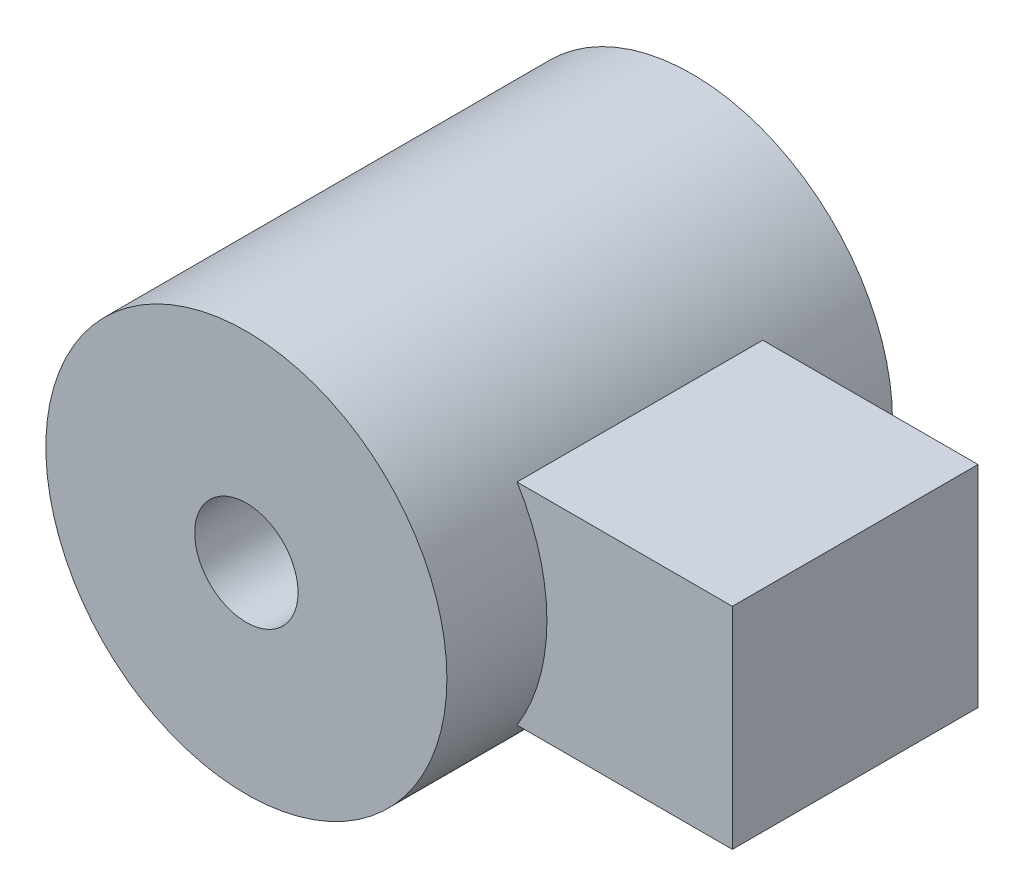
ISO-10303-21;
HEADER;
FILE_DESCRIPTION(('STEP AP214'),'2;1');
FILE_NAME('part.step','',(''),(''),'','','');
FILE_SCHEMA(('AUTOMOTIVE_DESIGN { 1 0 10303 214 1 1 1 1 }'));
ENDSEC;
DATA;
#1=APPLICATION_CONTEXT('core data for automotive mechanical design processes');
#2=APPLICATION_PROTOCOL_DEFINITION('international standard','automotive_design',2000,#1);
#3=PRODUCT_CONTEXT('',#1,'mechanical');
#4=PRODUCT('Part','Part','',(#3));
#5=PRODUCT_RELATED_PRODUCT_CATEGORY('part','',(#4));
#6=PRODUCT_DEFINITION_FORMATION('','',#4);
#7=PRODUCT_DEFINITION_CONTEXT('part definition',#1,'design');
#8=PRODUCT_DEFINITION('design','',#6,#7);
#9=PRODUCT_DEFINITION_SHAPE('','',#8);
#10=(LENGTH_UNIT() NAMED_UNIT(*) SI_UNIT(.MILLI.,.METRE.));
#11=(NAMED_UNIT(*) PLANE_ANGLE_UNIT() SI_UNIT($,.RADIAN.));
#12=(NAMED_UNIT(*) SI_UNIT($,.STERADIAN.) SOLID_ANGLE_UNIT());
#13=UNCERTAINTY_MEASURE_WITH_UNIT(LENGTH_MEASURE(1.E-05),#10,'distance_accuracy_value','');
#14=(GEOMETRIC_REPRESENTATION_CONTEXT(3) GLOBAL_UNCERTAINTY_ASSIGNED_CONTEXT((#13)) GLOBAL_UNIT_ASSIGNED_CONTEXT((#10,
#11,#12)) REPRESENTATION_CONTEXT('',''));
#15=CARTESIAN_POINT('',(0.,0.,0.));
#16=DIRECTION('',(0.,0.,1.));
#17=DIRECTION('',(1.,0.,0.));
#18=AXIS2_PLACEMENT_3D('',#15,#16,#17);
#19=CARTESIAN_POINT('',(0.,0.,12.7));
#20=DIRECTION('',(0.,0.,-1.));
#21=DIRECTION('',(-1.,0.,0.));
#22=AXIS2_PLACEMENT_3D('',#19,#20,#21);
#23=CYLINDRICAL_SURFACE('',#22,5.715);
#24=CARTESIAN_POINT('',(0.,0.,0.));
#25=DIRECTION('',(0.,0.,1.));
#26=DIRECTION('',(1.,0.,0.));
#27=AXIS2_PLACEMENT_3D('',#24,#25,#26);
#28=CIRCLE('',#27,5.715);
#29=CARTESIAN_POINT('',(5.715,0.,0.));
#30=VERTEX_POINT('',#29);
#31=EDGE_CURVE('E114',#30,#30,#28,.T.);
#32=ORIENTED_EDGE('',*,*,#31,.T.);
#33=EDGE_LOOP('',(#32));
#34=FACE_BOUND('',#33,.T.);
#35=CARTESIAN_POINT('',(0.,0.,12.7));
#36=DIRECTION('',(0.,0.,1.));
#37=DIRECTION('',(1.,0.,0.));
#38=AXIS2_PLACEMENT_3D('',#35,#36,#37);
#39=CIRCLE('',#38,5.715);
#40=CARTESIAN_POINT('',(5.715,0.,12.7));
#41=VERTEX_POINT('',#40);
#42=EDGE_CURVE('E116',#41,#41,#39,.T.);
#43=ORIENTED_EDGE('',*,*,#42,.F.);
#44=EDGE_LOOP('',(#43));
#45=FACE_BOUND('',#44,.T.);
#46=CARTESIAN_POINT('',(0.,0.,2.85));
#47=DIRECTION('',(0.,0.,1.));
#48=DIRECTION('',(0.,-1.,0.));
#49=AXIS2_PLACEMENT_3D('',#46,#47,#48);
#50=CIRCLE('',#49,5.715);
#51=CARTESIAN_POINT('',(4.86428052233832,-3.,2.85));
#52=VERTEX_POINT('',#51);
#53=CARTESIAN_POINT('',(4.86428052233832,3.,2.85));
#54=VERTEX_POINT('',#53);
#55=EDGE_CURVE('E11',#52,#54,#50,.T.);
#56=ORIENTED_EDGE('',*,*,#55,.F.);
#57=DIRECTION('',(0.,0.,-1.));
#58=VECTOR('',#57,1.);
#59=CARTESIAN_POINT('',(4.86428052233832,-3.,12.7));
#60=LINE('',#59,#58);
#61=CARTESIAN_POINT('',(4.86428052233832,-3.,9.85));
#62=VERTEX_POINT('',#61);
#63=EDGE_CURVE('E119',#62,#52,#60,.T.);
#64=ORIENTED_EDGE('',*,*,#63,.F.);
#65=CARTESIAN_POINT('',(0.,0.,9.85));
#66=DIRECTION('',(0.,0.,-1.));
#67=DIRECTION('',(0.,1.,0.));
#68=AXIS2_PLACEMENT_3D('',#65,#66,#67);
#69=CIRCLE('',#68,5.715);
#70=CARTESIAN_POINT('',(4.86428052233832,3.,9.85));
#71=VERTEX_POINT('',#70);
#72=EDGE_CURVE('E64',#71,#62,#69,.T.);
#73=ORIENTED_EDGE('',*,*,#72,.F.);
#74=DIRECTION('',(0.,0.,-1.));
#75=VECTOR('',#74,1.);
#76=CARTESIAN_POINT('',(4.86428052233832,3.,12.7));
#77=LINE('',#76,#75);
#78=EDGE_CURVE('E54',#54,#71,#77,.F.);
#79=ORIENTED_EDGE('',*,*,#78,.F.);
#80=EDGE_LOOP('',(#56,#64,#73,#79));
#81=FACE_BOUND('',#80,.T.);
#82=ADVANCED_FACE('F47',(#34,#45,#81),#23,.T.);
#83=CARTESIAN_POINT('',(0.,0.,12.7));
#84=DIRECTION('',(0.,0.,1.));
#85=DIRECTION('',(1.,0.,0.));
#86=AXIS2_PLACEMENT_3D('',#83,#84,#85);
#87=PLANE('',#86);
#88=CARTESIAN_POINT('',(0.,0.,12.7));
#89=DIRECTION('',(0.,0.,1.));
#90=DIRECTION('',(1.,0.,0.));
#91=AXIS2_PLACEMENT_3D('',#88,#89,#90);
#92=CIRCLE('',#91,1.4732);
#93=CARTESIAN_POINT('',(1.4732,0.,12.7));
#94=VERTEX_POINT('',#93);
#95=EDGE_CURVE('E104',#94,#94,#92,.T.);
#96=ORIENTED_EDGE('',*,*,#95,.F.);
#97=EDGE_LOOP('',(#96));
#98=FACE_BOUND('',#97,.T.);
#99=ORIENTED_EDGE('',*,*,#42,.T.);
#100=EDGE_LOOP('',(#99));
#101=FACE_BOUND('',#100,.T.);
#102=ADVANCED_FACE('F135',(#98,#101),#87,.T.);
#103=CARTESIAN_POINT('',(0.,0.,0.));
#104=DIRECTION('',(0.,0.,1.));
#105=DIRECTION('',(1.,0.,0.));
#106=AXIS2_PLACEMENT_3D('',#103,#104,#105);
#107=PLANE('',#106);
#108=CARTESIAN_POINT('',(0.,0.,0.));
#109=DIRECTION('',(0.,0.,1.));
#110=DIRECTION('',(1.,0.,0.));
#111=AXIS2_PLACEMENT_3D('',#108,#109,#110);
#112=CIRCLE('',#111,1.4732);
#113=CARTESIAN_POINT('',(1.4732,0.,0.));
#114=VERTEX_POINT('',#113);
#115=EDGE_CURVE('E107',#114,#114,#112,.T.);
#116=ORIENTED_EDGE('',*,*,#115,.T.);
#117=EDGE_LOOP('',(#116));
#118=FACE_BOUND('',#117,.T.);
#119=ORIENTED_EDGE('',*,*,#31,.F.);
#120=EDGE_LOOP('',(#119));
#121=FACE_BOUND('',#120,.T.);
#122=ADVANCED_FACE('F139',(#118,#121),#107,.F.);
#123=CARTESIAN_POINT('',(0.,0.,0.));
#124=DIRECTION('',(0.,0.,1.));
#125=DIRECTION('',(1.,0.,0.));
#126=AXIS2_PLACEMENT_3D('',#123,#124,#125);
#127=CYLINDRICAL_SURFACE('',#126,1.4732);
#128=CARTESIAN_POINT('',(1.4732,0.,0.));
#129=CARTESIAN_POINT('',(1.4732,0.,0.132291666666667));
#130=CARTESIAN_POINT('',(1.4732,0.,0.264583333333333));
#131=CARTESIAN_POINT('',(1.4732,0.,0.529166666666667));
#132=CARTESIAN_POINT('',(1.4732,0.,0.661458333333333));
#133=CARTESIAN_POINT('',(1.4732,0.,0.926041666666667));
#134=CARTESIAN_POINT('',(1.4732,0.,1.05833333333333));
#135=CARTESIAN_POINT('',(1.4732,0.,1.32291666666667));
#136=CARTESIAN_POINT('',(1.4732,0.,1.45520833333333));
#137=CARTESIAN_POINT('',(1.4732,0.,1.71979166666667));
#138=CARTESIAN_POINT('',(1.4732,0.,1.85208333333333));
#139=CARTESIAN_POINT('',(1.4732,0.,2.11666666666667));
#140=CARTESIAN_POINT('',(1.4732,0.,2.24895833333333));
#141=CARTESIAN_POINT('',(1.4732,0.,2.51354166666667));
#142=CARTESIAN_POINT('',(1.4732,0.,2.64583333333333));
#143=CARTESIAN_POINT('',(1.4732,0.,2.91041666666667));
#144=CARTESIAN_POINT('',(1.4732,0.,3.04270833333333));
#145=CARTESIAN_POINT('',(1.4732,0.,3.30729166666667));
#146=CARTESIAN_POINT('',(1.4732,0.,3.43958333333333));
#147=CARTESIAN_POINT('',(1.4732,0.,3.70416666666667));
#148=CARTESIAN_POINT('',(1.4732,0.,3.83645833333333));
#149=CARTESIAN_POINT('',(1.4732,0.,4.10104166666667));
#150=CARTESIAN_POINT('',(1.4732,0.,4.23333333333333));
#151=CARTESIAN_POINT('',(1.4732,0.,4.49791666666667));
#152=CARTESIAN_POINT('',(1.4732,0.,4.63020833333333));
#153=CARTESIAN_POINT('',(1.4732,0.,4.89479166666667));
#154=CARTESIAN_POINT('',(1.4732,0.,5.02708333333333));
#155=CARTESIAN_POINT('',(1.4732,0.,5.29166666666667));
#156=CARTESIAN_POINT('',(1.4732,0.,5.42395833333333));
#157=CARTESIAN_POINT('',(1.4732,0.,5.68854166666667));
#158=CARTESIAN_POINT('',(1.4732,0.,5.82083333333333));
#159=CARTESIAN_POINT('',(1.4732,0.,6.08541666666667));
#160=CARTESIAN_POINT('',(1.4732,0.,6.21770833333333));
#161=CARTESIAN_POINT('',(1.4732,0.,6.48229166666667));
#162=CARTESIAN_POINT('',(1.4732,0.,6.61458333333333));
#163=CARTESIAN_POINT('',(1.4732,0.,6.87916666666667));
#164=CARTESIAN_POINT('',(1.4732,0.,7.01145833333333));
#165=CARTESIAN_POINT('',(1.4732,0.,7.27604166666667));
#166=CARTESIAN_POINT('',(1.4732,0.,7.40833333333333));
#167=CARTESIAN_POINT('',(1.4732,0.,7.67291666666667));
#168=CARTESIAN_POINT('',(1.4732,0.,7.80520833333333));
#169=CARTESIAN_POINT('',(1.4732,0.,8.06979166666667));
#170=CARTESIAN_POINT('',(1.4732,0.,8.20208333333333));
#171=CARTESIAN_POINT('',(1.4732,0.,8.46666666666667));
#172=CARTESIAN_POINT('',(1.4732,0.,8.59895833333333));
#173=CARTESIAN_POINT('',(1.4732,0.,8.86354166666667));
#174=CARTESIAN_POINT('',(1.4732,0.,8.99583333333334));
#175=CARTESIAN_POINT('',(1.4732,0.,9.26041666666667));
#176=CARTESIAN_POINT('',(1.4732,0.,9.39270833333333));
#177=CARTESIAN_POINT('',(1.4732,0.,9.65729166666667));
#178=CARTESIAN_POINT('',(1.4732,0.,9.78958333333333));
#179=CARTESIAN_POINT('',(1.4732,0.,10.0541666666667));
#180=CARTESIAN_POINT('',(1.4732,0.,10.1864583333333));
#181=CARTESIAN_POINT('',(1.4732,0.,10.4510416666667));
#182=CARTESIAN_POINT('',(1.4732,0.,10.5833333333333));
#183=CARTESIAN_POINT('',(1.4732,0.,10.8479166666667));
#184=CARTESIAN_POINT('',(1.4732,0.,10.9802083333333));
#185=CARTESIAN_POINT('',(1.4732,0.,11.2447916666667));
#186=CARTESIAN_POINT('',(1.4732,0.,11.3770833333333));
#187=CARTESIAN_POINT('',(1.4732,0.,11.6416666666667));
#188=CARTESIAN_POINT('',(1.4732,0.,11.7739583333333));
#189=CARTESIAN_POINT('',(1.4732,0.,12.0385416666667));
#190=CARTESIAN_POINT('',(1.4732,0.,12.1708333333333));
#191=CARTESIAN_POINT('',(1.4732,0.,12.4354166666667));
#192=CARTESIAN_POINT('',(1.4732,0.,12.5677083333333));
#193=CARTESIAN_POINT('',(1.4732,0.,12.7));
#194=B_SPLINE_CURVE_WITH_KNOTS('',3,(#128,#129,#130,#131,#132,#133,#134,#135,#136,#137,#138,
#139,#140,#141,#142,#143,#144,#145,#146,#147,#148,#149,#150,#151,#152,#153,#154,#155,#156,#157,
#158,#159,#160,#161,#162,#163,#164,#165,#166,#167,#168,#169,#170,#171,#172,#173,#174,#175,#176,
#177,#178,#179,#180,#181,#182,#183,#184,#185,#186,#187,#188,#189,#190,#191,#192,#193),
.UNSPECIFIED.,.F.,.F.,(4,2,2,2,2,2,2,2,2,2,2,2,2,2,2,2,2,2,2,2,2,2,2,2,2,2,2,2,2,2,2,2,4),(0.,
0.396875,0.79375,1.190625,1.5875,1.984375,2.38125,2.778125,3.175,3.571875,3.96875,4.365625,
4.7625,5.159375,5.55625,5.953125,6.35,6.746875,7.14375,7.540625,7.9375,8.334375,8.73125,
9.128125,9.525,9.921875,10.31875,10.715625,11.1125,11.509375,11.90625,12.303125,12.7),.UNSPECIFIED.);
#195=EDGE_CURVE('BSEAM148',#114,#94,#194,.T.);
#196=ORIENTED_EDGE('',*,*,#115,.F.);
#197=ORIENTED_EDGE('',*,*,#95,.T.);
#198=ORIENTED_EDGE('',*,*,#195,.T.);
#199=ORIENTED_EDGE('',*,*,#195,.F.);
#200=EDGE_LOOP('',(#196,#198,#197,#199));
#201=FACE_BOUND('',#200,.T.);
#202=ADVANCED_FACE('F148',(#201),#127,.F.);
#203=CARTESIAN_POINT('',(11.,3.,9.85));
#204=DIRECTION('',(0.,-1.,0.));
#205=DIRECTION('',(0.,0.,-1.));
#206=AXIS2_PLACEMENT_3D('',#203,#204,#205);
#207=PLANE('',#206);
#208=DIRECTION('',(-1.,0.,0.));
#209=VECTOR('',#208,1.);
#210=CARTESIAN_POINT('',(11.,3.,2.85));
#211=LINE('',#210,#209);
#212=CARTESIAN_POINT('',(11.,3.,2.85));
#213=VERTEX_POINT('',#212);
#214=EDGE_CURVE('E87',#213,#54,#211,.T.);
#215=ORIENTED_EDGE('',*,*,#214,.T.);
#216=ORIENTED_EDGE('',*,*,#78,.T.);
#217=DIRECTION('',(-1.,0.,0.));
#218=VECTOR('',#217,1.);
#219=CARTESIAN_POINT('',(11.,3.,9.85));
#220=LINE('',#219,#218);
#221=CARTESIAN_POINT('',(11.,3.,9.85));
#222=VERTEX_POINT('',#221);
#223=EDGE_CURVE('E89',#222,#71,#220,.T.);
#224=ORIENTED_EDGE('',*,*,#223,.F.);
#225=DIRECTION('',(0.,0.,1.));
#226=VECTOR('',#225,1.);
#227=CARTESIAN_POINT('',(11.,3.,9.85));
#228=LINE('',#227,#226);
#229=EDGE_CURVE('E83',#213,#222,#228,.T.);
#230=ORIENTED_EDGE('',*,*,#229,.F.);
#231=EDGE_LOOP('',(#215,#216,#224,#230));
#232=FACE_BOUND('',#231,.T.);
#233=ADVANCED_FACE('F85',(#232),#207,.F.);
#234=CARTESIAN_POINT('',(11.,-3.,9.85));
#235=DIRECTION('',(0.,1.,0.));
#236=DIRECTION('',(0.,0.,1.));
#237=AXIS2_PLACEMENT_3D('',#234,#235,#236);
#238=PLANE('',#237);
#239=DIRECTION('',(-1.,0.,0.));
#240=VECTOR('',#239,1.);
#241=CARTESIAN_POINT('',(11.,-3.,9.85));
#242=LINE('',#241,#240);
#243=CARTESIAN_POINT('',(11.,-3.,9.85));
#244=VERTEX_POINT('',#243);
#245=EDGE_CURVE('E109',#244,#62,#242,.T.);
#246=ORIENTED_EDGE('',*,*,#245,.T.);
#247=ORIENTED_EDGE('',*,*,#63,.T.);
#248=DIRECTION('',(-1.,0.,0.));
#249=VECTOR('',#248,1.);
#250=CARTESIAN_POINT('',(11.,-3.,2.85));
#251=LINE('',#250,#249);
#252=CARTESIAN_POINT('',(11.,-3.,2.85));
#253=VERTEX_POINT('',#252);
#254=EDGE_CURVE('E129',#253,#52,#251,.T.);
#255=ORIENTED_EDGE('',*,*,#254,.F.);
#256=DIRECTION('',(0.,0.,-1.));
#257=VECTOR('',#256,1.);
#258=CARTESIAN_POINT('',(11.,-3.,9.85));
#259=LINE('',#258,#257);
#260=EDGE_CURVE('E98',#244,#253,#259,.T.);
#261=ORIENTED_EDGE('',*,*,#260,.F.);
#262=EDGE_LOOP('',(#246,#247,#255,#261));
#263=FACE_BOUND('',#262,.T.);
#264=ADVANCED_FACE('F133',(#263),#238,.F.);
#265=CARTESIAN_POINT('',(11.,3.,2.85));
#266=DIRECTION('',(0.,0.,1.));
#267=DIRECTION('',(0.,-1.,0.));
#268=AXIS2_PLACEMENT_3D('',#265,#266,#267);
#269=PLANE('',#268);
#270=ORIENTED_EDGE('',*,*,#254,.T.);
#271=ORIENTED_EDGE('',*,*,#55,.T.);
#272=ORIENTED_EDGE('',*,*,#214,.F.);
#273=DIRECTION('',(0.,1.,0.));
#274=VECTOR('',#273,1.);
#275=CARTESIAN_POINT('',(11.,3.,2.85));
#276=LINE('',#275,#274);
#277=EDGE_CURVE('E93',#253,#213,#276,.T.);
#278=ORIENTED_EDGE('',*,*,#277,.F.);
#279=EDGE_LOOP('',(#270,#271,#272,#278));
#280=FACE_BOUND('',#279,.T.);
#281=ADVANCED_FACE('F103',(#280),#269,.F.);
#282=CARTESIAN_POINT('',(11.,3.,9.85));
#283=DIRECTION('',(0.,0.,-1.));
#284=DIRECTION('',(0.,1.,0.));
#285=AXIS2_PLACEMENT_3D('',#282,#283,#284);
#286=PLANE('',#285);
#287=ORIENTED_EDGE('',*,*,#223,.T.);
#288=ORIENTED_EDGE('',*,*,#72,.T.);
#289=ORIENTED_EDGE('',*,*,#245,.F.);
#290=DIRECTION('',(0.,-1.,0.));
#291=VECTOR('',#290,1.);
#292=CARTESIAN_POINT('',(11.,3.,9.85));
#293=LINE('',#292,#291);
#294=EDGE_CURVE('E92',#222,#244,#293,.T.);
#295=ORIENTED_EDGE('',*,*,#294,.F.);
#296=EDGE_LOOP('',(#287,#288,#289,#295));
#297=FACE_BOUND('',#296,.T.);
#298=ADVANCED_FACE('F125',(#297),#286,.F.);
#299=CARTESIAN_POINT('',(11.,0.,0.));
#300=DIRECTION('',(1.,0.,0.));
#301=DIRECTION('',(0.,0.,-1.));
#302=AXIS2_PLACEMENT_3D('',#299,#300,#301);
#303=PLANE('',#302);
#304=ORIENTED_EDGE('',*,*,#277,.T.);
#305=ORIENTED_EDGE('',*,*,#229,.T.);
#306=ORIENTED_EDGE('',*,*,#294,.T.);
#307=ORIENTED_EDGE('',*,*,#260,.T.);
#308=EDGE_LOOP('',(#304,#305,#306,#307));
#309=FACE_BOUND('',#308,.T.);
#310=ADVANCED_FACE('F96',(#309),#303,.T.);
#311=CLOSED_SHELL('',(#82,#102,#122,#202,#233,#264,#281,#298,#310));
#312=MANIFOLD_SOLID_BREP('B2',#311);
#313=ADVANCED_BREP_SHAPE_REPRESENTATION('',(#18,#312),#14);
#314=SHAPE_DEFINITION_REPRESENTATION(#9,#313);
ENDSEC;
END-ISO-10303-21;
